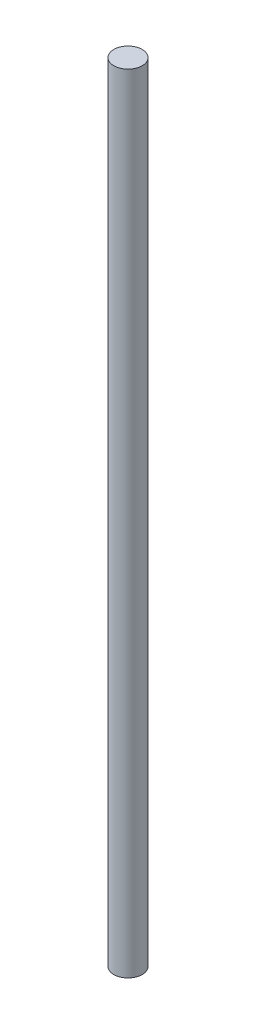
ISO-10303-21;
HEADER;
FILE_DESCRIPTION(('STEP AP214'),'2;1');
FILE_NAME('part.step','',(''),(''),'','','');
FILE_SCHEMA(('AUTOMOTIVE_DESIGN { 1 0 10303 214 1 1 1 1 }'));
ENDSEC;
DATA;
#1=APPLICATION_CONTEXT('core data for automotive mechanical design processes');
#2=APPLICATION_PROTOCOL_DEFINITION('international standard','automotive_design',2000,#1);
#3=PRODUCT_CONTEXT('',#1,'mechanical');
#4=PRODUCT('Part','Part','',(#3));
#5=PRODUCT_RELATED_PRODUCT_CATEGORY('part','',(#4));
#6=PRODUCT_DEFINITION_FORMATION('','',#4);
#7=PRODUCT_DEFINITION_CONTEXT('part definition',#1,'design');
#8=PRODUCT_DEFINITION('design','',#6,#7);
#9=PRODUCT_DEFINITION_SHAPE('','',#8);
#10=(LENGTH_UNIT() NAMED_UNIT(*) SI_UNIT(.MILLI.,.METRE.));
#11=(NAMED_UNIT(*) PLANE_ANGLE_UNIT() SI_UNIT($,.RADIAN.));
#12=(NAMED_UNIT(*) SI_UNIT($,.STERADIAN.) SOLID_ANGLE_UNIT());
#13=UNCERTAINTY_MEASURE_WITH_UNIT(LENGTH_MEASURE(1.E-05),#10,'distance_accuracy_value','');
#14=(GEOMETRIC_REPRESENTATION_CONTEXT(3) GLOBAL_UNCERTAINTY_ASSIGNED_CONTEXT((#13)) GLOBAL_UNIT_ASSIGNED_CONTEXT((#10,
#11,#12)) REPRESENTATION_CONTEXT('',''));
#15=CARTESIAN_POINT('',(0.,0.,0.));
#16=DIRECTION('',(0.,0.,1.));
#17=DIRECTION('',(1.,0.,0.));
#18=AXIS2_PLACEMENT_3D('',#15,#16,#17);
#19=CARTESIAN_POINT('',(0.,111.,0.));
#20=DIRECTION('',(0.,-1.,0.));
#21=DIRECTION('',(0.,0.,-1.));
#22=AXIS2_PLACEMENT_3D('',#19,#20,#21);
#23=CYLINDRICAL_SURFACE('',#22,2.);
#24=CARTESIAN_POINT('',(0.,111.,0.));
#25=DIRECTION('',(0.,1.,0.));
#26=DIRECTION('',(0.,0.,1.));
#27=AXIS2_PLACEMENT_3D('',#24,#25,#26);
#28=CIRCLE('',#27,2.);
#29=CARTESIAN_POINT('',(0.,111.,2.));
#30=VERTEX_POINT('',#29);
#31=EDGE_CURVE('E10',#30,#30,#28,.T.);
#32=ORIENTED_EDGE('',*,*,#31,.F.);
#33=EDGE_LOOP('',(#32));
#34=FACE_BOUND('',#33,.T.);
#35=CARTESIAN_POINT('',(0.,0.,0.));
#36=DIRECTION('',(0.,1.,0.));
#37=DIRECTION('',(0.,0.,1.));
#38=AXIS2_PLACEMENT_3D('',#35,#36,#37);
#39=CIRCLE('',#38,2.);
#40=CARTESIAN_POINT('',(0.,0.,2.));
#41=VERTEX_POINT('',#40);
#42=EDGE_CURVE('E34',#41,#41,#39,.T.);
#43=ORIENTED_EDGE('',*,*,#42,.T.);
#44=EDGE_LOOP('',(#43));
#45=FACE_BOUND('',#44,.T.);
#46=ADVANCED_FACE('F31',(#34,#45),#23,.T.);
#47=CARTESIAN_POINT('',(0.,111.,0.));
#48=DIRECTION('',(0.,1.,0.));
#49=DIRECTION('',(0.,0.,1.));
#50=AXIS2_PLACEMENT_3D('',#47,#48,#49);
#51=PLANE('',#50);
#52=ORIENTED_EDGE('',*,*,#31,.T.);
#53=EDGE_LOOP('',(#52));
#54=FACE_BOUND('',#53,.T.);
#55=ADVANCED_FACE('F46',(#54),#51,.T.);
#56=CARTESIAN_POINT('',(0.,0.,0.));
#57=DIRECTION('',(0.,1.,0.));
#58=DIRECTION('',(0.,0.,1.));
#59=AXIS2_PLACEMENT_3D('',#56,#57,#58);
#60=PLANE('',#59);
#61=ORIENTED_EDGE('',*,*,#42,.F.);
#62=EDGE_LOOP('',(#61));
#63=FACE_BOUND('',#62,.T.);
#64=ADVANCED_FACE('F44',(#63),#60,.F.);
#65=CLOSED_SHELL('',(#46,#55,#64));
#66=MANIFOLD_SOLID_BREP('B2',#65);
#67=ADVANCED_BREP_SHAPE_REPRESENTATION('',(#18,#66),#14);
#68=SHAPE_DEFINITION_REPRESENTATION(#9,#67);
ENDSEC;
END-ISO-10303-21;
